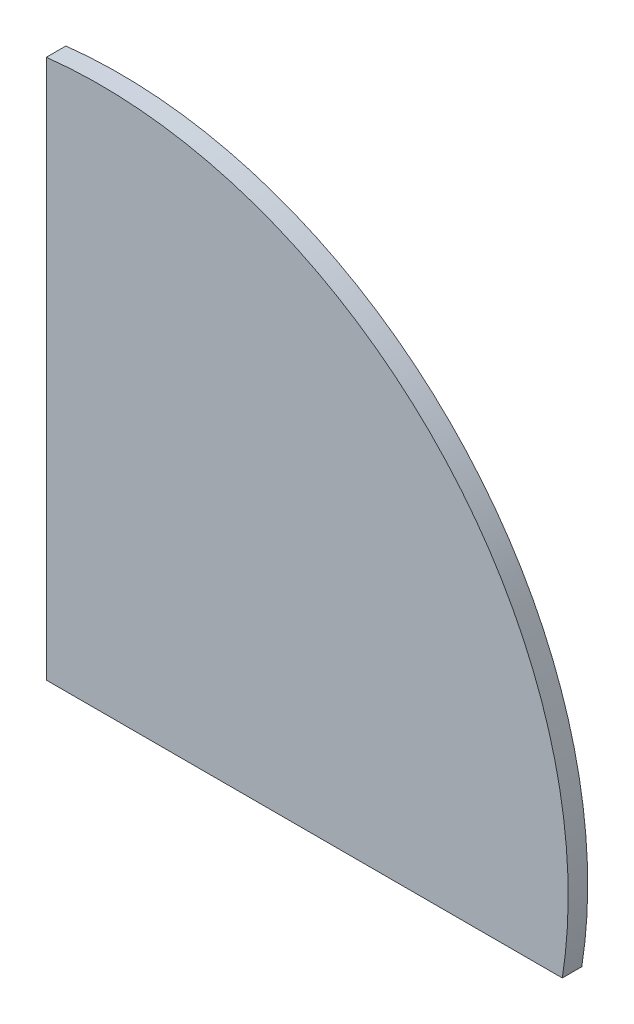
ISO-10303-21;
HEADER;
FILE_DESCRIPTION(('STEP AP214'),'2;1');
FILE_NAME('part.step','',(''),(''),'','','');
FILE_SCHEMA(('AUTOMOTIVE_DESIGN { 1 0 10303 214 1 1 1 1 }'));
ENDSEC;
DATA;
#1=APPLICATION_CONTEXT('core data for automotive mechanical design processes');
#2=APPLICATION_PROTOCOL_DEFINITION('international standard','automotive_design',2000,#1);
#3=PRODUCT_CONTEXT('',#1,'mechanical');
#4=PRODUCT('Part','Part','',(#3));
#5=PRODUCT_RELATED_PRODUCT_CATEGORY('part','',(#4));
#6=PRODUCT_DEFINITION_FORMATION('','',#4);
#7=PRODUCT_DEFINITION_CONTEXT('part definition',#1,'design');
#8=PRODUCT_DEFINITION('design','',#6,#7);
#9=PRODUCT_DEFINITION_SHAPE('','',#8);
#10=(LENGTH_UNIT() NAMED_UNIT(*) SI_UNIT(.MILLI.,.METRE.));
#11=(NAMED_UNIT(*) PLANE_ANGLE_UNIT() SI_UNIT($,.RADIAN.));
#12=(NAMED_UNIT(*) SI_UNIT($,.STERADIAN.) SOLID_ANGLE_UNIT());
#13=UNCERTAINTY_MEASURE_WITH_UNIT(LENGTH_MEASURE(1.E-05),#10,'distance_accuracy_value','');
#14=(GEOMETRIC_REPRESENTATION_CONTEXT(3) GLOBAL_UNCERTAINTY_ASSIGNED_CONTEXT((#13)) GLOBAL_UNIT_ASSIGNED_CONTEXT((#10,
#11,#12)) REPRESENTATION_CONTEXT('',''));
#15=CARTESIAN_POINT('',(0.,0.,0.));
#16=DIRECTION('',(0.,0.,1.));
#17=DIRECTION('',(1.,0.,0.));
#18=AXIS2_PLACEMENT_3D('',#15,#16,#17);
#19=CARTESIAN_POINT('',(0.,0.,75.));
#20=DIRECTION('',(0.,0.,-1.));
#21=DIRECTION('',(-1.,0.,0.));
#22=AXIS2_PLACEMENT_3D('',#19,#20,#21);
#23=CYLINDRICAL_SURFACE('',#22,240.);
#24=DIRECTION('',(0.,0.,-1.));
#25=VECTOR('',#24,1.);
#26=CARTESIAN_POINT('',(-27.4110339249947,238.429518346959,75.));
#27=LINE('',#26,#25);
#28=CARTESIAN_POINT('',(-27.4110339249947,238.429518346959,-43.5200000000001));
#29=VERTEX_POINT('',#28);
#30=CARTESIAN_POINT('',(-27.4110339249947,238.429518346959,-53.5200000000002));
#31=VERTEX_POINT('',#30);
#32=EDGE_CURVE('E12',#29,#31,#27,.T.);
#33=ORIENTED_EDGE('',*,*,#32,.F.);
#34=CARTESIAN_POINT('',(0.,0.,-43.52));
#35=DIRECTION('',(0.,0.,-1.));
#36=DIRECTION('',(0.,1.,0.));
#37=AXIS2_PLACEMENT_3D('',#34,#35,#36);
#38=CIRCLE('',#37,240.);
#39=CARTESIAN_POINT('',(236.977735538125,-37.9677871257004,-43.52));
#40=VERTEX_POINT('',#39);
#41=EDGE_CURVE('E71',#40,#29,#38,.F.);
#42=ORIENTED_EDGE('',*,*,#41,.F.);
#43=DIRECTION('',(0.,0.,-1.));
#44=VECTOR('',#43,1.);
#45=CARTESIAN_POINT('',(236.977735538125,-37.9677871257,75.));
#46=LINE('',#45,#44);
#47=CARTESIAN_POINT('',(236.977735538125,-37.9677871257001,-53.52));
#48=VERTEX_POINT('',#47);
#49=EDGE_CURVE('E42',#48,#40,#46,.F.);
#50=ORIENTED_EDGE('',*,*,#49,.F.);
#51=CARTESIAN_POINT('',(0.,0.,-53.52));
#52=DIRECTION('',(0.,0.,-1.));
#53=DIRECTION('',(0.,1.,0.));
#54=AXIS2_PLACEMENT_3D('',#51,#52,#53);
#55=CIRCLE('',#54,240.);
#56=EDGE_CURVE('E67',#31,#48,#55,.T.);
#57=ORIENTED_EDGE('',*,*,#56,.F.);
#58=EDGE_LOOP('',(#33,#42,#50,#57));
#59=FACE_BOUND('',#58,.T.);
#60=ADVANCED_FACE('F34',(#59),#23,.T.);
#61=CARTESIAN_POINT('',(-27.4110339249947,0.,75.));
#62=DIRECTION('',(-1.,0.,0.));
#63=DIRECTION('',(0.,0.,1.));
#64=AXIS2_PLACEMENT_3D('',#61,#62,#63);
#65=PLANE('',#64);
#66=DIRECTION('',(0.,1.,0.));
#67=VECTOR('',#66,1.);
#68=CARTESIAN_POINT('',(-27.4110339249947,238.429518346959,-43.5200000000002));
#69=LINE('',#68,#67);
#70=CARTESIAN_POINT('',(-27.4110339249947,-37.9677871257001,-43.52));
#71=VERTEX_POINT('',#70);
#72=EDGE_CURVE('E61',#71,#29,#69,.T.);
#73=ORIENTED_EDGE('',*,*,#72,.T.);
#74=ORIENTED_EDGE('',*,*,#32,.T.);
#75=DIRECTION('',(0.,1.,0.));
#76=VECTOR('',#75,1.);
#77=CARTESIAN_POINT('',(-27.4110339249947,238.429518346959,-53.5200000000002));
#78=LINE('',#77,#76);
#79=CARTESIAN_POINT('',(-27.4110339249947,-37.9677871257001,-53.52));
#80=VERTEX_POINT('',#79);
#81=EDGE_CURVE('E83',#80,#31,#78,.T.);
#82=ORIENTED_EDGE('',*,*,#81,.F.);
#83=DIRECTION('',(0.,0.,1.));
#84=VECTOR('',#83,1.);
#85=CARTESIAN_POINT('',(-27.4110339249947,-37.9677871257001,-53.52));
#86=LINE('',#85,#84);
#87=EDGE_CURVE('E65',#80,#71,#86,.T.);
#88=ORIENTED_EDGE('',*,*,#87,.T.);
#89=EDGE_LOOP('',(#73,#74,#82,#88));
#90=FACE_BOUND('',#89,.T.);
#91=ADVANCED_FACE('F63',(#90),#65,.T.);
#92=CARTESIAN_POINT('',(240.,-37.9677871257001,27.418));
#93=DIRECTION('',(0.,-1.,0.));
#94=DIRECTION('',(0.,0.,-1.));
#95=AXIS2_PLACEMENT_3D('',#92,#93,#94);
#96=PLANE('',#95);
#97=ORIENTED_EDGE('',*,*,#49,.T.);
#98=DIRECTION('',(-1.,0.,0.));
#99=VECTOR('',#98,1.);
#100=CARTESIAN_POINT('',(-27.4110339249947,-37.9677871257001,-43.52));
#101=LINE('',#100,#99);
#102=EDGE_CURVE('E68',#40,#71,#101,.T.);
#103=ORIENTED_EDGE('',*,*,#102,.T.);
#104=ORIENTED_EDGE('',*,*,#87,.F.);
#105=DIRECTION('',(-1.,0.,0.));
#106=VECTOR('',#105,1.);
#107=CARTESIAN_POINT('',(226.844543996054,-37.9677871257001,-53.52));
#108=LINE('',#107,#106);
#109=EDGE_CURVE('E81',#48,#80,#108,.T.);
#110=ORIENTED_EDGE('',*,*,#109,.F.);
#111=EDGE_LOOP('',(#97,#103,#104,#110));
#112=FACE_BOUND('',#111,.T.);
#113=ADVANCED_FACE('F89',(#112),#96,.T.);
#114=CARTESIAN_POINT('',(0.,0.,-43.52));
#115=DIRECTION('',(0.,0.,-1.));
#116=DIRECTION('',(0.,1.,0.));
#117=AXIS2_PLACEMENT_3D('',#114,#115,#116);
#118=PLANE('',#117);
#119=ORIENTED_EDGE('',*,*,#102,.F.);
#120=ORIENTED_EDGE('',*,*,#41,.T.);
#121=ORIENTED_EDGE('',*,*,#72,.F.);
#122=EDGE_LOOP('',(#119,#120,#121));
#123=FACE_BOUND('',#122,.T.);
#124=ADVANCED_FACE('F72',(#123),#118,.F.);
#125=CARTESIAN_POINT('',(0.,0.,-53.52));
#126=DIRECTION('',(0.,0.,-1.));
#127=DIRECTION('',(0.,1.,0.));
#128=AXIS2_PLACEMENT_3D('',#125,#126,#127);
#129=PLANE('',#128);
#130=ORIENTED_EDGE('',*,*,#56,.T.);
#131=ORIENTED_EDGE('',*,*,#109,.T.);
#132=ORIENTED_EDGE('',*,*,#81,.T.);
#133=EDGE_LOOP('',(#130,#131,#132));
#134=FACE_BOUND('',#133,.T.);
#135=ADVANCED_FACE('F90',(#134),#129,.T.);
#136=CLOSED_SHELL('',(#60,#91,#113,#124,#135));
#137=MANIFOLD_SOLID_BREP('B2',#136);
#138=ADVANCED_BREP_SHAPE_REPRESENTATION('',(#18,#137),#14);
#139=SHAPE_DEFINITION_REPRESENTATION(#9,#138);
ENDSEC;
END-ISO-10303-21;
